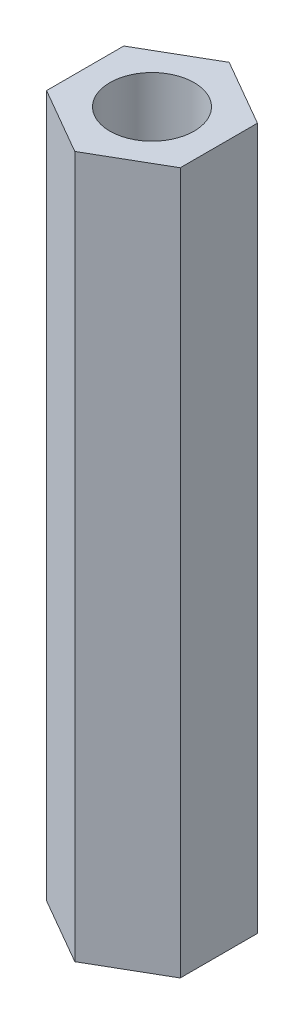
ISO-10303-21;
HEADER;
FILE_DESCRIPTION(('STEP AP214'),'2;1');
FILE_NAME('part.step','',(''),(''),'','','');
FILE_SCHEMA(('AUTOMOTIVE_DESIGN { 1 0 10303 214 1 1 1 1 }'));
ENDSEC;
DATA;
#1=APPLICATION_CONTEXT('core data for automotive mechanical design processes');
#2=APPLICATION_PROTOCOL_DEFINITION('international standard','automotive_design',2000,#1);
#3=PRODUCT_CONTEXT('',#1,'mechanical');
#4=PRODUCT('Part','Part','',(#3));
#5=PRODUCT_RELATED_PRODUCT_CATEGORY('part','',(#4));
#6=PRODUCT_DEFINITION_FORMATION('','',#4);
#7=PRODUCT_DEFINITION_CONTEXT('part definition',#1,'design');
#8=PRODUCT_DEFINITION('design','',#6,#7);
#9=PRODUCT_DEFINITION_SHAPE('','',#8);
#10=(LENGTH_UNIT() NAMED_UNIT(*) SI_UNIT(.MILLI.,.METRE.));
#11=(NAMED_UNIT(*) PLANE_ANGLE_UNIT() SI_UNIT($,.RADIAN.));
#12=(NAMED_UNIT(*) SI_UNIT($,.STERADIAN.) SOLID_ANGLE_UNIT());
#13=UNCERTAINTY_MEASURE_WITH_UNIT(LENGTH_MEASURE(1.E-05),#10,'distance_accuracy_value','');
#14=(GEOMETRIC_REPRESENTATION_CONTEXT(3) GLOBAL_UNCERTAINTY_ASSIGNED_CONTEXT((#13)) GLOBAL_UNIT_ASSIGNED_CONTEXT((#10,
#11,#12)) REPRESENTATION_CONTEXT('',''));
#15=CARTESIAN_POINT('',(0.,0.,0.));
#16=DIRECTION('',(0.,0.,1.));
#17=DIRECTION('',(1.,0.,0.));
#18=AXIS2_PLACEMENT_3D('',#15,#16,#17);
#19=CARTESIAN_POINT('',(0.,25.,0.));
#20=DIRECTION('',(0.,1.,0.));
#21=DIRECTION('',(0.,0.,1.));
#22=AXIS2_PLACEMENT_3D('',#19,#20,#21);
#23=PLANE('',#22);
#24=DIRECTION('',(-0.866025403784439,0.,-0.5));
#25=VECTOR('',#24,1.);
#26=CARTESIAN_POINT('',(2.38156986040721,25.,-1.375));
#27=LINE('',#26,#25);
#28=CARTESIAN_POINT('',(2.38156986040721,25.,-1.375));
#29=VERTEX_POINT('',#28);
#30=CARTESIAN_POINT('',(0.,25.,-2.75));
#31=VERTEX_POINT('',#30);
#32=EDGE_CURVE('E150',#29,#31,#27,.T.);
#33=ORIENTED_EDGE('',*,*,#32,.T.);
#34=DIRECTION('',(-0.866025403784439,0.,0.5));
#35=VECTOR('',#34,1.);
#36=CARTESIAN_POINT('',(0.,25.,-2.75));
#37=LINE('',#36,#35);
#38=CARTESIAN_POINT('',(-2.38156986040721,25.,-1.375));
#39=VERTEX_POINT('',#38);
#40=EDGE_CURVE('E98',#31,#39,#37,.T.);
#41=ORIENTED_EDGE('',*,*,#40,.T.);
#42=DIRECTION('',(0.,0.,1.));
#43=VECTOR('',#42,1.);
#44=CARTESIAN_POINT('',(-2.38156986040721,25.,-1.375));
#45=LINE('',#44,#43);
#46=CARTESIAN_POINT('',(-2.38156986040721,25.,1.375));
#47=VERTEX_POINT('',#46);
#48=EDGE_CURVE('E111',#39,#47,#45,.T.);
#49=ORIENTED_EDGE('',*,*,#48,.T.);
#50=DIRECTION('',(0.866025403784439,0.,0.5));
#51=VECTOR('',#50,1.);
#52=CARTESIAN_POINT('',(-2.38156986040721,25.,1.375));
#53=LINE('',#52,#51);
#54=CARTESIAN_POINT('',(0.,25.,2.75));
#55=VERTEX_POINT('',#54);
#56=EDGE_CURVE('E105',#47,#55,#53,.T.);
#57=ORIENTED_EDGE('',*,*,#56,.T.);
#58=DIRECTION('',(0.866025403784439,0.,-0.5));
#59=VECTOR('',#58,1.);
#60=CARTESIAN_POINT('',(0.,25.,2.75));
#61=LINE('',#60,#59);
#62=CARTESIAN_POINT('',(2.38156986040721,25.,1.375));
#63=VERTEX_POINT('',#62);
#64=EDGE_CURVE('E109',#55,#63,#61,.T.);
#65=ORIENTED_EDGE('',*,*,#64,.T.);
#66=DIRECTION('',(0.,0.,-1.));
#67=VECTOR('',#66,1.);
#68=CARTESIAN_POINT('',(2.38156986040721,25.,1.375));
#69=LINE('',#68,#67);
#70=EDGE_CURVE('E61',#63,#29,#69,.T.);
#71=ORIENTED_EDGE('',*,*,#70,.T.);
#72=EDGE_LOOP('',(#33,#41,#49,#57,#65,#71));
#73=FACE_BOUND('',#72,.T.);
#74=CARTESIAN_POINT('',(0.,25.,0.));
#75=DIRECTION('',(0.,1.,0.));
#76=DIRECTION('',(0.,0.,1.));
#77=AXIS2_PLACEMENT_3D('',#74,#75,#76);
#78=CIRCLE('',#77,1.5);
#79=CARTESIAN_POINT('',(0.,25.,1.5));
#80=VERTEX_POINT('',#79);
#81=EDGE_CURVE('E138',#80,#80,#78,.T.);
#82=ORIENTED_EDGE('',*,*,#81,.F.);
#83=EDGE_LOOP('',(#82));
#84=FACE_BOUND('',#83,.T.);
#85=ADVANCED_FACE('F43',(#73,#84),#23,.T.);
#86=CARTESIAN_POINT('',(0.,0.,0.));
#87=DIRECTION('',(0.,1.,0.));
#88=DIRECTION('',(0.,0.,1.));
#89=AXIS2_PLACEMENT_3D('',#86,#87,#88);
#90=PLANE('',#89);
#91=DIRECTION('',(-0.866025403784439,0.,-0.5));
#92=VECTOR('',#91,1.);
#93=CARTESIAN_POINT('',(2.38156986040721,0.,-1.375));
#94=LINE('',#93,#92);
#95=CARTESIAN_POINT('',(2.38156986040721,0.,-1.375));
#96=VERTEX_POINT('',#95);
#97=CARTESIAN_POINT('',(0.,0.,-2.75));
#98=VERTEX_POINT('',#97);
#99=EDGE_CURVE('E133',#96,#98,#94,.T.);
#100=ORIENTED_EDGE('',*,*,#99,.F.);
#101=DIRECTION('',(0.,0.,-1.));
#102=VECTOR('',#101,1.);
#103=CARTESIAN_POINT('',(2.38156986040721,0.,1.375));
#104=LINE('',#103,#102);
#105=CARTESIAN_POINT('',(2.38156986040721,0.,1.375));
#106=VERTEX_POINT('',#105);
#107=EDGE_CURVE('E90',#106,#96,#104,.T.);
#108=ORIENTED_EDGE('',*,*,#107,.F.);
#109=DIRECTION('',(0.866025403784439,0.,-0.5));
#110=VECTOR('',#109,1.);
#111=CARTESIAN_POINT('',(0.,0.,2.75));
#112=LINE('',#111,#110);
#113=CARTESIAN_POINT('',(0.,0.,2.75));
#114=VERTEX_POINT('',#113);
#115=EDGE_CURVE('E84',#114,#106,#112,.T.);
#116=ORIENTED_EDGE('',*,*,#115,.F.);
#117=DIRECTION('',(0.866025403784439,0.,0.5));
#118=VECTOR('',#117,1.);
#119=CARTESIAN_POINT('',(-2.38156986040721,0.,1.375));
#120=LINE('',#119,#118);
#121=CARTESIAN_POINT('',(-2.38156986040721,0.,1.375));
#122=VERTEX_POINT('',#121);
#123=EDGE_CURVE('E120',#122,#114,#120,.T.);
#124=ORIENTED_EDGE('',*,*,#123,.F.);
#125=DIRECTION('',(0.,0.,1.));
#126=VECTOR('',#125,1.);
#127=CARTESIAN_POINT('',(-2.38156986040721,0.,-1.375));
#128=LINE('',#127,#126);
#129=CARTESIAN_POINT('',(-2.38156986040721,0.,-1.375));
#130=VERTEX_POINT('',#129);
#131=EDGE_CURVE('E141',#130,#122,#128,.T.);
#132=ORIENTED_EDGE('',*,*,#131,.F.);
#133=DIRECTION('',(-0.866025403784439,0.,0.5));
#134=VECTOR('',#133,1.);
#135=CARTESIAN_POINT('',(0.,0.,-2.75));
#136=LINE('',#135,#134);
#137=EDGE_CURVE('E137',#98,#130,#136,.T.);
#138=ORIENTED_EDGE('',*,*,#137,.F.);
#139=EDGE_LOOP('',(#100,#108,#116,#124,#132,#138));
#140=FACE_BOUND('',#139,.T.);
#141=CARTESIAN_POINT('',(0.,0.,0.));
#142=DIRECTION('',(0.,1.,0.));
#143=DIRECTION('',(0.,0.,1.));
#144=AXIS2_PLACEMENT_3D('',#141,#142,#143);
#145=CIRCLE('',#144,1.5);
#146=CARTESIAN_POINT('',(0.,0.,1.5));
#147=VERTEX_POINT('',#146);
#148=EDGE_CURVE('E265',#147,#147,#145,.T.);
#149=ORIENTED_EDGE('',*,*,#148,.T.);
#150=EDGE_LOOP('',(#149));
#151=FACE_BOUND('',#150,.T.);
#152=ADVANCED_FACE('F163',(#140,#151),#90,.F.);
#153=CARTESIAN_POINT('',(2.38156986040721,25.,-1.375));
#154=DIRECTION('',(-0.5,0.,0.866025403784439));
#155=DIRECTION('',(0.866025403784439,0.,0.5));
#156=AXIS2_PLACEMENT_3D('',#153,#154,#155);
#157=PLANE('',#156);
#158=ORIENTED_EDGE('',*,*,#99,.T.);
#159=DIRECTION('',(0.,-1.,0.));
#160=VECTOR('',#159,1.);
#161=CARTESIAN_POINT('',(0.,25.,-2.75));
#162=LINE('',#161,#160);
#163=EDGE_CURVE('E11',#31,#98,#162,.T.);
#164=ORIENTED_EDGE('',*,*,#163,.F.);
#165=ORIENTED_EDGE('',*,*,#32,.F.);
#166=DIRECTION('',(0.,-1.,0.));
#167=VECTOR('',#166,1.);
#168=CARTESIAN_POINT('',(2.38156986040721,25.,-1.375));
#169=LINE('',#168,#167);
#170=EDGE_CURVE('E129',#29,#96,#169,.T.);
#171=ORIENTED_EDGE('',*,*,#170,.T.);
#172=EDGE_LOOP('',(#158,#164,#165,#171));
#173=FACE_BOUND('',#172,.T.);
#174=ADVANCED_FACE('F45',(#173),#157,.F.);
#175=CARTESIAN_POINT('',(0.,25.,-2.75));
#176=DIRECTION('',(0.5,0.,0.866025403784439));
#177=DIRECTION('',(0.866025403784439,0.,-0.5));
#178=AXIS2_PLACEMENT_3D('',#175,#176,#177);
#179=PLANE('',#178);
#180=ORIENTED_EDGE('',*,*,#137,.T.);
#181=DIRECTION('',(0.,-1.,0.));
#182=VECTOR('',#181,1.);
#183=CARTESIAN_POINT('',(-2.38156986040721,25.,-1.375));
#184=LINE('',#183,#182);
#185=EDGE_CURVE('E53',#39,#130,#184,.T.);
#186=ORIENTED_EDGE('',*,*,#185,.F.);
#187=ORIENTED_EDGE('',*,*,#40,.F.);
#188=ORIENTED_EDGE('',*,*,#163,.T.);
#189=EDGE_LOOP('',(#180,#186,#187,#188));
#190=FACE_BOUND('',#189,.T.);
#191=ADVANCED_FACE('F188',(#190),#179,.F.);
#192=CARTESIAN_POINT('',(-2.38156986040721,25.,-1.375));
#193=DIRECTION('',(1.,0.,0.));
#194=DIRECTION('',(0.,0.,-1.));
#195=AXIS2_PLACEMENT_3D('',#192,#193,#194);
#196=PLANE('',#195);
#197=ORIENTED_EDGE('',*,*,#131,.T.);
#198=DIRECTION('',(0.,-1.,0.));
#199=VECTOR('',#198,1.);
#200=CARTESIAN_POINT('',(-2.38156986040721,25.,1.375));
#201=LINE('',#200,#199);
#202=EDGE_CURVE('E122',#47,#122,#201,.T.);
#203=ORIENTED_EDGE('',*,*,#202,.F.);
#204=ORIENTED_EDGE('',*,*,#48,.F.);
#205=ORIENTED_EDGE('',*,*,#185,.T.);
#206=EDGE_LOOP('',(#197,#203,#204,#205));
#207=FACE_BOUND('',#206,.T.);
#208=ADVANCED_FACE('F160',(#207),#196,.F.);
#209=CARTESIAN_POINT('',(-2.38156986040721,25.,1.375));
#210=DIRECTION('',(0.5,0.,-0.866025403784439));
#211=DIRECTION('',(-0.866025403784439,0.,-0.5));
#212=AXIS2_PLACEMENT_3D('',#209,#210,#211);
#213=PLANE('',#212);
#214=ORIENTED_EDGE('',*,*,#123,.T.);
#215=DIRECTION('',(0.,-1.,0.));
#216=VECTOR('',#215,1.);
#217=CARTESIAN_POINT('',(0.,25.,2.75));
#218=LINE('',#217,#216);
#219=EDGE_CURVE('E117',#55,#114,#218,.T.);
#220=ORIENTED_EDGE('',*,*,#219,.F.);
#221=ORIENTED_EDGE('',*,*,#56,.F.);
#222=ORIENTED_EDGE('',*,*,#202,.T.);
#223=EDGE_LOOP('',(#214,#220,#221,#222));
#224=FACE_BOUND('',#223,.T.);
#225=ADVANCED_FACE('F118',(#224),#213,.F.);
#226=CARTESIAN_POINT('',(0.,25.,2.75));
#227=DIRECTION('',(-0.5,0.,-0.866025403784439));
#228=DIRECTION('',(-0.866025403784439,0.,0.5));
#229=AXIS2_PLACEMENT_3D('',#226,#227,#228);
#230=PLANE('',#229);
#231=ORIENTED_EDGE('',*,*,#115,.T.);
#232=DIRECTION('',(0.,-1.,0.));
#233=VECTOR('',#232,1.);
#234=CARTESIAN_POINT('',(2.38156986040721,25.,1.375));
#235=LINE('',#234,#233);
#236=EDGE_CURVE('E123',#63,#106,#235,.T.);
#237=ORIENTED_EDGE('',*,*,#236,.F.);
#238=ORIENTED_EDGE('',*,*,#64,.F.);
#239=ORIENTED_EDGE('',*,*,#219,.T.);
#240=EDGE_LOOP('',(#231,#237,#238,#239));
#241=FACE_BOUND('',#240,.T.);
#242=ADVANCED_FACE('F125',(#241),#230,.F.);
#243=CARTESIAN_POINT('',(2.38156986040721,25.,1.375));
#244=DIRECTION('',(-1.,0.,0.));
#245=DIRECTION('',(0.,0.,1.));
#246=AXIS2_PLACEMENT_3D('',#243,#244,#245);
#247=PLANE('',#246);
#248=ORIENTED_EDGE('',*,*,#107,.T.);
#249=ORIENTED_EDGE('',*,*,#170,.F.);
#250=ORIENTED_EDGE('',*,*,#70,.F.);
#251=ORIENTED_EDGE('',*,*,#236,.T.);
#252=EDGE_LOOP('',(#248,#249,#250,#251));
#253=FACE_BOUND('',#252,.T.);
#254=ADVANCED_FACE('F168',(#253),#247,.F.);
#255=CARTESIAN_POINT('',(0.,25.,0.));
#256=DIRECTION('',(0.,-1.,0.));
#257=DIRECTION('',(0.,0.,-1.));
#258=AXIS2_PLACEMENT_3D('',#255,#256,#257);
#259=CYLINDRICAL_SURFACE('',#258,1.5);
#260=ORIENTED_EDGE('',*,*,#81,.T.);
#261=EDGE_LOOP('',(#260));
#262=FACE_BOUND('',#261,.T.);
#263=ORIENTED_EDGE('',*,*,#148,.F.);
#264=EDGE_LOOP('',(#263));
#265=FACE_BOUND('',#264,.T.);
#266=ADVANCED_FACE('F170',(#262,#265),#259,.F.);
#267=CLOSED_SHELL('',(#85,#152,#174,#191,#208,#225,#242,#254,#266));
#268=MANIFOLD_SOLID_BREP('B2',#267);
#269=ADVANCED_BREP_SHAPE_REPRESENTATION('',(#18,#268),#14);
#270=SHAPE_DEFINITION_REPRESENTATION(#9,#269);
ENDSEC;
END-ISO-10303-21;
